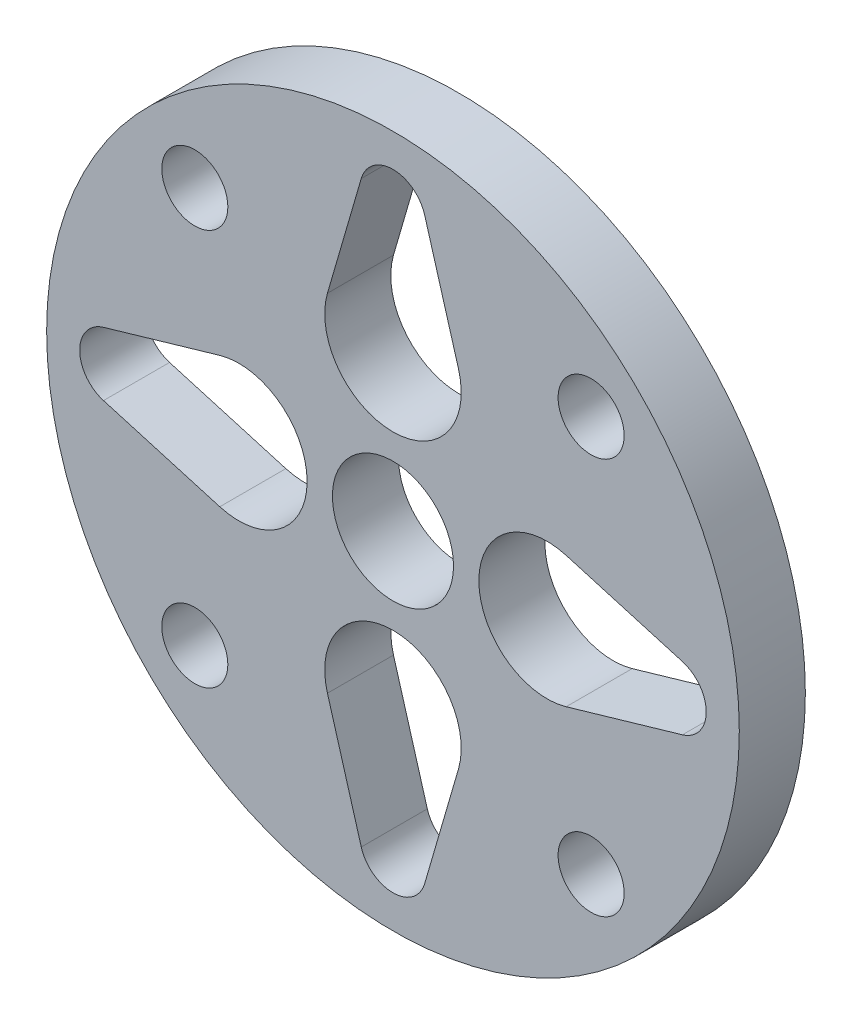
ISO-10303-21;
HEADER;
FILE_DESCRIPTION(('STEP AP214'),'2;1');
FILE_NAME('part.step','',(''),(''),'','','');
FILE_SCHEMA(('AUTOMOTIVE_DESIGN { 1 0 10303 214 1 1 1 1 }'));
ENDSEC;
DATA;
#1=APPLICATION_CONTEXT('core data for automotive mechanical design processes');
#2=APPLICATION_PROTOCOL_DEFINITION('international standard','automotive_design',2000,#1);
#3=PRODUCT_CONTEXT('',#1,'mechanical');
#4=PRODUCT('Part','Part','',(#3));
#5=PRODUCT_RELATED_PRODUCT_CATEGORY('part','',(#4));
#6=PRODUCT_DEFINITION_FORMATION('','',#4);
#7=PRODUCT_DEFINITION_CONTEXT('part definition',#1,'design');
#8=PRODUCT_DEFINITION('design','',#6,#7);
#9=PRODUCT_DEFINITION_SHAPE('','',#8);
#10=(LENGTH_UNIT() NAMED_UNIT(*) SI_UNIT(.MILLI.,.METRE.));
#11=(NAMED_UNIT(*) PLANE_ANGLE_UNIT() SI_UNIT($,.RADIAN.));
#12=(NAMED_UNIT(*) SI_UNIT($,.STERADIAN.) SOLID_ANGLE_UNIT());
#13=UNCERTAINTY_MEASURE_WITH_UNIT(LENGTH_MEASURE(1.E-05),#10,'distance_accuracy_value','');
#14=(GEOMETRIC_REPRESENTATION_CONTEXT(3) GLOBAL_UNCERTAINTY_ASSIGNED_CONTEXT((#13)) GLOBAL_UNIT_ASSIGNED_CONTEXT((#10,
#11,#12)) REPRESENTATION_CONTEXT('',''));
#15=CARTESIAN_POINT('',(0.,0.,0.));
#16=DIRECTION('',(0.,0.,1.));
#17=DIRECTION('',(1.,0.,0.));
#18=AXIS2_PLACEMENT_3D('',#15,#16,#17);
#19=CARTESIAN_POINT('',(22.4681726177,284.7304475597,3.));
#20=DIRECTION('',(0.,0.,1.));
#21=DIRECTION('',(1.,0.,0.));
#22=AXIS2_PLACEMENT_3D('',#19,#20,#21);
#23=PLANE('',#22);
#24=CARTESIAN_POINT('',(13.4681726177,293.7304475597,3.));
#25=DIRECTION('',(0.,0.,1.));
#26=DIRECTION('',(1.,0.,0.));
#27=AXIS2_PLACEMENT_3D('',#24,#25,#26);
#28=CIRCLE('',#27,1.5);
#29=CARTESIAN_POINT('',(14.9681726177,293.7304475597,3.));
#30=VERTEX_POINT('',#29);
#31=EDGE_CURVE('E306',#30,#30,#28,.T.);
#32=ORIENTED_EDGE('',*,*,#31,.F.);
#33=EDGE_LOOP('',(#32));
#34=FACE_BOUND('',#33,.T.);
#35=CARTESIAN_POINT('',(31.4681726177,275.7304475597,3.));
#36=DIRECTION('',(0.,0.,1.));
#37=DIRECTION('',(1.,0.,0.));
#38=AXIS2_PLACEMENT_3D('',#35,#36,#37);
#39=CIRCLE('',#38,1.5);
#40=CARTESIAN_POINT('',(32.9681726177,275.7304475597,3.));
#41=VERTEX_POINT('',#40);
#42=EDGE_CURVE('E316',#41,#41,#39,.T.);
#43=ORIENTED_EDGE('',*,*,#42,.F.);
#44=EDGE_LOOP('',(#43));
#45=FACE_BOUND('',#44,.T.);
#46=DIRECTION('',(0.960194171098327,0.279333409725363,0.));
#47=VECTOR('',#46,1.);
#48=CARTESIAN_POINT('',(35.6150947936,283.2901563031,3.));
#49=LINE('',#48,#47);
#50=CARTESIAN_POINT('',(30.3341061878,281.7538456293,3.));
#51=VERTEX_POINT('',#50);
#52=CARTESIAN_POINT('',(35.6150947936,283.2901563031,3.));
#53=VERTEX_POINT('',#52);
#54=EDGE_CURVE('E154',#51,#53,#49,.T.);
#55=ORIENTED_EDGE('',*,*,#54,.F.);
#56=CARTESIAN_POINT('',(29.468172617635,284.7304475597,3.));
#57=DIRECTION('',(0.,0.,1.));
#58=DIRECTION('',(1.,0.,0.));
#59=AXIS2_PLACEMENT_3D('',#56,#57,#58);
#60=CIRCLE('',#59,3.09999999999996);
#61=CARTESIAN_POINT('',(30.3341061878,287.7070494901,3.));
#62=VERTEX_POINT('',#61);
#63=EDGE_CURVE('E146',#62,#51,#60,.T.);
#64=ORIENTED_EDGE('',*,*,#63,.F.);
#65=DIRECTION('',(-0.960194171103202,0.279333409708604,0.));
#66=VECTOR('',#65,1.);
#67=CARTESIAN_POINT('',(35.6150947936,286.1707388164,3.));
#68=LINE('',#67,#66);
#69=CARTESIAN_POINT('',(35.6150947936,286.1707388164,3.));
#70=VERTEX_POINT('',#69);
#71=EDGE_CURVE('E169',#70,#62,#68,.T.);
#72=ORIENTED_EDGE('',*,*,#71,.F.);
#73=CARTESIAN_POINT('',(35.1960946790205,284.73044755975,3.));
#74=DIRECTION('',(0.,0.,1.));
#75=DIRECTION('',(1.,0.,0.));
#76=AXIS2_PLACEMENT_3D('',#73,#74,#75);
#77=CIRCLE('',#76,1.50000000000003);
#78=EDGE_CURVE('E167',#53,#70,#77,.T.);
#79=ORIENTED_EDGE('',*,*,#78,.F.);
#80=EDGE_LOOP('',(#55,#64,#72,#79));
#81=FACE_BOUND('',#80,.T.);
#82=DIRECTION('',(-0.960194171104621,-0.279333409703727,0.));
#83=VECTOR('',#82,1.);
#84=CARTESIAN_POINT('',(9.3212504417,286.1707388164,3.));
#85=LINE('',#84,#83);
#86=CARTESIAN_POINT('',(14.6022390476,287.7070494901,3.));
#87=VERTEX_POINT('',#86);
#88=CARTESIAN_POINT('',(9.32125044170001,286.1707388164,3.));
#89=VERTEX_POINT('',#88);
#90=EDGE_CURVE('E218',#87,#89,#85,.T.);
#91=ORIENTED_EDGE('',*,*,#90,.F.);
#92=CARTESIAN_POINT('',(15.468172617765,284.7304475597,3.));
#93=DIRECTION('',(0.,0.,1.));
#94=DIRECTION('',(1.,0.,0.));
#95=AXIS2_PLACEMENT_3D('',#92,#93,#94);
#96=CIRCLE('',#95,3.09999999999996);
#97=CARTESIAN_POINT('',(14.6022390476,281.7538456293,3.));
#98=VERTEX_POINT('',#97);
#99=EDGE_CURVE('E216',#98,#87,#96,.T.);
#100=ORIENTED_EDGE('',*,*,#99,.F.);
#101=DIRECTION('',(0.960194171099745,-0.279333409720486,0.));
#102=VECTOR('',#101,1.);
#103=CARTESIAN_POINT('',(9.3212504417,283.2901563031,3.));
#104=LINE('',#103,#102);
#105=CARTESIAN_POINT('',(9.3212504417,283.2901563031,3.));
#106=VERTEX_POINT('',#105);
#107=EDGE_CURVE('E224',#106,#98,#104,.T.);
#108=ORIENTED_EDGE('',*,*,#107,.F.);
#109=CARTESIAN_POINT('',(9.74025055627935,284.73044755975,3.));
#110=DIRECTION('',(0.,0.,1.));
#111=DIRECTION('',(1.,0.,0.));
#112=AXIS2_PLACEMENT_3D('',#109,#110,#111);
#113=CIRCLE('',#112,1.49999999999997);
#114=EDGE_CURVE('E221',#89,#106,#113,.T.);
#115=ORIENTED_EDGE('',*,*,#114,.F.);
#116=EDGE_LOOP('',(#91,#100,#108,#115));
#117=FACE_BOUND('',#116,.T.);
#118=CARTESIAN_POINT('',(22.4681726177,284.7304475597,3.));
#119=DIRECTION('',(0.,0.,1.));
#120=DIRECTION('',(1.,0.,0.));
#121=AXIS2_PLACEMENT_3D('',#118,#119,#120);
#122=CIRCLE('',#121,15.73);
#123=CARTESIAN_POINT('',(38.1981726177,284.7304475597,3.));
#124=VERTEX_POINT('',#123);
#125=EDGE_CURVE('E11',#124,#124,#122,.T.);
#126=ORIENTED_EDGE('',*,*,#125,.T.);
#127=EDGE_LOOP('',(#126));
#128=FACE_BOUND('',#127,.T.);
#129=DIRECTION('',(-0.279333409725365,0.960194171098326,0.));
#130=VECTOR('',#129,1.);
#131=CARTESIAN_POINT('',(23.9084638743,297.8773697356,3.));
#132=LINE('',#131,#130);
#133=CARTESIAN_POINT('',(25.4447745481,292.5963811298,3.));
#134=VERTEX_POINT('',#133);
#135=CARTESIAN_POINT('',(23.9084638743,297.8773697356,3.));
#136=VERTEX_POINT('',#135);
#137=EDGE_CURVE('E249',#134,#136,#132,.T.);
#138=ORIENTED_EDGE('',*,*,#137,.F.);
#139=CARTESIAN_POINT('',(22.4681726177,291.730447559635,3.));
#140=DIRECTION('',(0.,0.,1.));
#141=DIRECTION('',(1.,0.,0.));
#142=AXIS2_PLACEMENT_3D('',#139,#140,#141);
#143=CIRCLE('',#142,3.1);
#144=CARTESIAN_POINT('',(19.4915706873,292.5963811298,3.));
#145=VERTEX_POINT('',#144);
#146=EDGE_CURVE('E247',#145,#134,#143,.T.);
#147=ORIENTED_EDGE('',*,*,#146,.F.);
#148=DIRECTION('',(-0.279333409708601,-0.960194171103203,0.));
#149=VECTOR('',#148,1.);
#150=CARTESIAN_POINT('',(21.027881361,297.8773697356,3.));
#151=LINE('',#150,#149);
#152=CARTESIAN_POINT('',(21.027881361,297.8773697356,3.));
#153=VERTEX_POINT('',#152);
#154=EDGE_CURVE('E255',#153,#145,#151,.T.);
#155=ORIENTED_EDGE('',*,*,#154,.F.);
#156=CARTESIAN_POINT('',(22.46817261765,297.45836962102,3.));
#157=DIRECTION('',(0.,0.,1.));
#158=DIRECTION('',(1.,0.,0.));
#159=AXIS2_PLACEMENT_3D('',#156,#157,#158);
#160=CIRCLE('',#159,1.50000000000001);
#161=EDGE_CURVE('E252',#136,#153,#160,.T.);
#162=ORIENTED_EDGE('',*,*,#161,.F.);
#163=EDGE_LOOP('',(#138,#147,#155,#162));
#164=FACE_BOUND('',#163,.T.);
#165=DIRECTION('',(0.279333409708598,-0.960194171103203,0.));
#166=VECTOR('',#165,1.);
#167=CARTESIAN_POINT('',(21.027881361,271.5835253838,3.));
#168=LINE('',#167,#166);
#169=CARTESIAN_POINT('',(19.4915706873,276.8645139896,3.));
#170=VERTEX_POINT('',#169);
#171=CARTESIAN_POINT('',(21.027881361,271.5835253838,3.));
#172=VERTEX_POINT('',#171);
#173=EDGE_CURVE('E187',#170,#172,#168,.T.);
#174=ORIENTED_EDGE('',*,*,#173,.F.);
#175=CARTESIAN_POINT('',(22.4681726177,277.730447559765,3.));
#176=DIRECTION('',(0.,0.,1.));
#177=DIRECTION('',(1.,0.,0.));
#178=AXIS2_PLACEMENT_3D('',#175,#176,#177);
#179=CIRCLE('',#178,3.1);
#180=CARTESIAN_POINT('',(25.4447745481,276.8645139896,3.));
#181=VERTEX_POINT('',#180);
#182=EDGE_CURVE('E185',#181,#170,#179,.T.);
#183=ORIENTED_EDGE('',*,*,#182,.F.);
#184=DIRECTION('',(0.279333409725362,0.960194171098327,0.));
#185=VECTOR('',#184,1.);
#186=CARTESIAN_POINT('',(23.9084638743,271.5835253838,3.));
#187=LINE('',#186,#185);
#188=CARTESIAN_POINT('',(23.9084638743,271.5835253838,3.));
#189=VERTEX_POINT('',#188);
#190=EDGE_CURVE('E193',#189,#181,#187,.T.);
#191=ORIENTED_EDGE('',*,*,#190,.F.);
#192=CARTESIAN_POINT('',(22.46817261765,272.002525498379,3.));
#193=DIRECTION('',(0.,0.,1.));
#194=DIRECTION('',(1.,0.,0.));
#195=AXIS2_PLACEMENT_3D('',#192,#193,#194);
#196=CIRCLE('',#195,1.50000000000001);
#197=EDGE_CURVE('E190',#172,#189,#196,.T.);
#198=ORIENTED_EDGE('',*,*,#197,.F.);
#199=EDGE_LOOP('',(#174,#183,#191,#198));
#200=FACE_BOUND('',#199,.T.);
#201=CARTESIAN_POINT('',(13.4681726177,275.7304475597,3.));
#202=DIRECTION('',(0.,0.,1.));
#203=DIRECTION('',(1.,0.,0.));
#204=AXIS2_PLACEMENT_3D('',#201,#202,#203);
#205=CIRCLE('',#204,1.5);
#206=CARTESIAN_POINT('',(14.9681726177,275.7304475597,3.));
#207=VERTEX_POINT('',#206);
#208=EDGE_CURVE('E175',#207,#207,#205,.T.);
#209=ORIENTED_EDGE('',*,*,#208,.F.);
#210=EDGE_LOOP('',(#209));
#211=FACE_BOUND('',#210,.T.);
#212=CARTESIAN_POINT('',(31.4681726177,293.7304475597,3.));
#213=DIRECTION('',(0.,0.,1.));
#214=DIRECTION('',(1.,0.,0.));
#215=AXIS2_PLACEMENT_3D('',#212,#213,#214);
#216=CIRCLE('',#215,1.5);
#217=CARTESIAN_POINT('',(32.9681726177,293.7304475597,3.));
#218=VERTEX_POINT('',#217);
#219=EDGE_CURVE('E311',#218,#218,#216,.T.);
#220=ORIENTED_EDGE('',*,*,#219,.F.);
#221=EDGE_LOOP('',(#220));
#222=FACE_BOUND('',#221,.T.);
#223=CARTESIAN_POINT('',(22.4681726177,284.7304475597,3.));
#224=DIRECTION('',(0.,0.,1.));
#225=DIRECTION('',(1.,0.,0.));
#226=AXIS2_PLACEMENT_3D('',#223,#224,#225);
#227=CIRCLE('',#226,2.75);
#228=CARTESIAN_POINT('',(25.2181726177,284.7304475597,3.));
#229=VERTEX_POINT('',#228);
#230=EDGE_CURVE('E300',#229,#229,#227,.T.);
#231=ORIENTED_EDGE('',*,*,#230,.F.);
#232=EDGE_LOOP('',(#231));
#233=FACE_BOUND('',#232,.T.);
#234=ADVANCED_FACE('F33',(#34,#45,#81,#117,#128,#164,#200,#211,#222,#233),#23,.T.);
#235=CARTESIAN_POINT('',(22.4681726177,284.7304475597,0.));
#236=DIRECTION('',(0.,0.,1.));
#237=DIRECTION('',(1.,0.,0.));
#238=AXIS2_PLACEMENT_3D('',#235,#236,#237);
#239=PLANE('',#238);
#240=CARTESIAN_POINT('',(13.4681726177,293.7304475597,0.));
#241=DIRECTION('',(0.,0.,1.));
#242=DIRECTION('',(1.,0.,0.));
#243=AXIS2_PLACEMENT_3D('',#240,#241,#242);
#244=CIRCLE('',#243,1.5);
#245=CARTESIAN_POINT('',(14.9681726177,293.7304475597,0.));
#246=VERTEX_POINT('',#245);
#247=EDGE_CURVE('E303',#246,#246,#244,.T.);
#248=ORIENTED_EDGE('',*,*,#247,.T.);
#249=EDGE_LOOP('',(#248));
#250=FACE_BOUND('',#249,.T.);
#251=CARTESIAN_POINT('',(31.4681726177,275.7304475597,0.));
#252=DIRECTION('',(0.,0.,1.));
#253=DIRECTION('',(1.,0.,0.));
#254=AXIS2_PLACEMENT_3D('',#251,#252,#253);
#255=CIRCLE('',#254,1.5);
#256=CARTESIAN_POINT('',(32.9681726177,275.7304475597,0.));
#257=VERTEX_POINT('',#256);
#258=EDGE_CURVE('E314',#257,#257,#255,.T.);
#259=ORIENTED_EDGE('',*,*,#258,.T.);
#260=EDGE_LOOP('',(#259));
#261=FACE_BOUND('',#260,.T.);
#262=CARTESIAN_POINT('',(29.468172617635,284.7304475597,0.));
#263=DIRECTION('',(0.,0.,1.));
#264=DIRECTION('',(1.,0.,0.));
#265=AXIS2_PLACEMENT_3D('',#262,#263,#264);
#266=CIRCLE('',#265,3.09999999999996);
#267=CARTESIAN_POINT('',(30.3341061878,287.7070494901,0.));
#268=VERTEX_POINT('',#267);
#269=CARTESIAN_POINT('',(30.3341061878,281.7538456293,0.));
#270=VERTEX_POINT('',#269);
#271=EDGE_CURVE('E56',#268,#270,#266,.T.);
#272=ORIENTED_EDGE('',*,*,#271,.T.);
#273=DIRECTION('',(0.960194171098327,0.279333409725363,0.));
#274=VECTOR('',#273,1.);
#275=CARTESIAN_POINT('',(35.6150947936,283.2901563031,0.));
#276=LINE('',#275,#274);
#277=CARTESIAN_POINT('',(35.6150947936,283.2901563031,0.));
#278=VERTEX_POINT('',#277);
#279=EDGE_CURVE('E161',#270,#278,#276,.T.);
#280=ORIENTED_EDGE('',*,*,#279,.T.);
#281=CARTESIAN_POINT('',(35.1960946790205,284.73044755975,0.));
#282=DIRECTION('',(0.,0.,1.));
#283=DIRECTION('',(1.,0.,0.));
#284=AXIS2_PLACEMENT_3D('',#281,#282,#283);
#285=CIRCLE('',#284,1.50000000000003);
#286=CARTESIAN_POINT('',(35.6150947936,286.1707388164,0.));
#287=VERTEX_POINT('',#286);
#288=EDGE_CURVE('E177',#278,#287,#285,.T.);
#289=ORIENTED_EDGE('',*,*,#288,.T.);
#290=DIRECTION('',(-0.960194171103202,0.279333409708604,0.));
#291=VECTOR('',#290,1.);
#292=CARTESIAN_POINT('',(35.6150947936,286.1707388164,0.));
#293=LINE('',#292,#291);
#294=EDGE_CURVE('E155',#287,#268,#293,.T.);
#295=ORIENTED_EDGE('',*,*,#294,.T.);
#296=EDGE_LOOP('',(#272,#280,#289,#295));
#297=FACE_BOUND('',#296,.T.);
#298=CARTESIAN_POINT('',(15.468172617765,284.7304475597,0.));
#299=DIRECTION('',(0.,0.,1.));
#300=DIRECTION('',(1.,0.,0.));
#301=AXIS2_PLACEMENT_3D('',#298,#299,#300);
#302=CIRCLE('',#301,3.09999999999996);
#303=CARTESIAN_POINT('',(14.6022390476,281.7538456293,0.));
#304=VERTEX_POINT('',#303);
#305=CARTESIAN_POINT('',(14.6022390476,287.7070494901,0.));
#306=VERTEX_POINT('',#305);
#307=EDGE_CURVE('E215',#304,#306,#302,.T.);
#308=ORIENTED_EDGE('',*,*,#307,.T.);
#309=DIRECTION('',(-0.960194171104621,-0.279333409703727,0.));
#310=VECTOR('',#309,1.);
#311=CARTESIAN_POINT('',(9.3212504417,286.1707388164,0.));
#312=LINE('',#311,#310);
#313=CARTESIAN_POINT('',(9.32125044170001,286.1707388164,0.));
#314=VERTEX_POINT('',#313);
#315=EDGE_CURVE('E229',#306,#314,#312,.T.);
#316=ORIENTED_EDGE('',*,*,#315,.T.);
#317=CARTESIAN_POINT('',(9.74025055627935,284.73044755975,0.));
#318=DIRECTION('',(0.,0.,1.));
#319=DIRECTION('',(1.,0.,0.));
#320=AXIS2_PLACEMENT_3D('',#317,#318,#319);
#321=CIRCLE('',#320,1.49999999999997);
#322=CARTESIAN_POINT('',(9.3212504417,283.2901563031,0.));
#323=VERTEX_POINT('',#322);
#324=EDGE_CURVE('E232',#314,#323,#321,.T.);
#325=ORIENTED_EDGE('',*,*,#324,.T.);
#326=DIRECTION('',(0.960194171099745,-0.279333409720486,0.));
#327=VECTOR('',#326,1.);
#328=CARTESIAN_POINT('',(9.3212504417,283.2901563031,0.));
#329=LINE('',#328,#327);
#330=EDGE_CURVE('E219',#323,#304,#329,.T.);
#331=ORIENTED_EDGE('',*,*,#330,.T.);
#332=EDGE_LOOP('',(#308,#316,#325,#331));
#333=FACE_BOUND('',#332,.T.);
#334=CARTESIAN_POINT('',(22.4681726177,284.7304475597,0.));
#335=DIRECTION('',(0.,0.,1.));
#336=DIRECTION('',(1.,0.,0.));
#337=AXIS2_PLACEMENT_3D('',#334,#335,#336);
#338=CIRCLE('',#337,15.73);
#339=CARTESIAN_POINT('',(38.1981726177,284.7304475597,0.));
#340=VERTEX_POINT('',#339);
#341=EDGE_CURVE('E37',#340,#340,#338,.T.);
#342=ORIENTED_EDGE('',*,*,#341,.F.);
#343=EDGE_LOOP('',(#342));
#344=FACE_BOUND('',#343,.T.);
#345=CARTESIAN_POINT('',(22.4681726177,291.730447559635,0.));
#346=DIRECTION('',(0.,0.,1.));
#347=DIRECTION('',(1.,0.,0.));
#348=AXIS2_PLACEMENT_3D('',#345,#346,#347);
#349=CIRCLE('',#348,3.1);
#350=CARTESIAN_POINT('',(19.4915706873,292.5963811298,0.));
#351=VERTEX_POINT('',#350);
#352=CARTESIAN_POINT('',(25.4447745481,292.5963811298,0.));
#353=VERTEX_POINT('',#352);
#354=EDGE_CURVE('E246',#351,#353,#349,.T.);
#355=ORIENTED_EDGE('',*,*,#354,.T.);
#356=DIRECTION('',(-0.279333409725365,0.960194171098326,0.));
#357=VECTOR('',#356,1.);
#358=CARTESIAN_POINT('',(23.9084638743,297.8773697356,0.));
#359=LINE('',#358,#357);
#360=CARTESIAN_POINT('',(23.9084638743,297.8773697356,0.));
#361=VERTEX_POINT('',#360);
#362=EDGE_CURVE('E260',#353,#361,#359,.T.);
#363=ORIENTED_EDGE('',*,*,#362,.T.);
#364=CARTESIAN_POINT('',(22.46817261765,297.45836962102,0.));
#365=DIRECTION('',(0.,0.,1.));
#366=DIRECTION('',(1.,0.,0.));
#367=AXIS2_PLACEMENT_3D('',#364,#365,#366);
#368=CIRCLE('',#367,1.50000000000001);
#369=CARTESIAN_POINT('',(21.027881361,297.8773697356,0.));
#370=VERTEX_POINT('',#369);
#371=EDGE_CURVE('E263',#361,#370,#368,.T.);
#372=ORIENTED_EDGE('',*,*,#371,.T.);
#373=DIRECTION('',(-0.279333409708601,-0.960194171103203,0.));
#374=VECTOR('',#373,1.);
#375=CARTESIAN_POINT('',(21.027881361,297.8773697356,0.));
#376=LINE('',#375,#374);
#377=EDGE_CURVE('E250',#370,#351,#376,.T.);
#378=ORIENTED_EDGE('',*,*,#377,.T.);
#379=EDGE_LOOP('',(#355,#363,#372,#378));
#380=FACE_BOUND('',#379,.T.);
#381=CARTESIAN_POINT('',(22.4681726177,277.730447559765,0.));
#382=DIRECTION('',(0.,0.,1.));
#383=DIRECTION('',(1.,0.,0.));
#384=AXIS2_PLACEMENT_3D('',#381,#382,#383);
#385=CIRCLE('',#384,3.1);
#386=CARTESIAN_POINT('',(25.4447745481,276.8645139896,0.));
#387=VERTEX_POINT('',#386);
#388=CARTESIAN_POINT('',(19.4915706873,276.8645139896,0.));
#389=VERTEX_POINT('',#388);
#390=EDGE_CURVE('E162',#387,#389,#385,.T.);
#391=ORIENTED_EDGE('',*,*,#390,.T.);
#392=DIRECTION('',(0.279333409708598,-0.960194171103203,0.));
#393=VECTOR('',#392,1.);
#394=CARTESIAN_POINT('',(21.027881361,271.5835253838,0.));
#395=LINE('',#394,#393);
#396=CARTESIAN_POINT('',(21.027881361,271.5835253838,0.));
#397=VERTEX_POINT('',#396);
#398=EDGE_CURVE('E198',#389,#397,#395,.T.);
#399=ORIENTED_EDGE('',*,*,#398,.T.);
#400=CARTESIAN_POINT('',(22.46817261765,272.002525498379,0.));
#401=DIRECTION('',(0.,0.,1.));
#402=DIRECTION('',(1.,0.,0.));
#403=AXIS2_PLACEMENT_3D('',#400,#401,#402);
#404=CIRCLE('',#403,1.50000000000001);
#405=CARTESIAN_POINT('',(23.9084638743,271.5835253838,0.));
#406=VERTEX_POINT('',#405);
#407=EDGE_CURVE('E201',#397,#406,#404,.T.);
#408=ORIENTED_EDGE('',*,*,#407,.T.);
#409=DIRECTION('',(0.279333409725362,0.960194171098327,0.));
#410=VECTOR('',#409,1.);
#411=CARTESIAN_POINT('',(23.9084638743,271.5835253838,0.));
#412=LINE('',#411,#410);
#413=EDGE_CURVE('E188',#406,#387,#412,.T.);
#414=ORIENTED_EDGE('',*,*,#413,.T.);
#415=EDGE_LOOP('',(#391,#399,#408,#414));
#416=FACE_BOUND('',#415,.T.);
#417=CARTESIAN_POINT('',(13.4681726177,275.7304475597,0.));
#418=DIRECTION('',(0.,0.,1.));
#419=DIRECTION('',(1.,0.,0.));
#420=AXIS2_PLACEMENT_3D('',#417,#418,#419);
#421=CIRCLE('',#420,1.5);
#422=CARTESIAN_POINT('',(14.9681726177,275.7304475597,0.));
#423=VERTEX_POINT('',#422);
#424=EDGE_CURVE('E291',#423,#423,#421,.T.);
#425=ORIENTED_EDGE('',*,*,#424,.T.);
#426=EDGE_LOOP('',(#425));
#427=FACE_BOUND('',#426,.T.);
#428=CARTESIAN_POINT('',(31.4681726177,293.7304475597,0.));
#429=DIRECTION('',(0.,0.,1.));
#430=DIRECTION('',(1.,0.,0.));
#431=AXIS2_PLACEMENT_3D('',#428,#429,#430);
#432=CIRCLE('',#431,1.5);
#433=CARTESIAN_POINT('',(32.9681726177,293.7304475597,0.));
#434=VERTEX_POINT('',#433);
#435=EDGE_CURVE('E295',#434,#434,#432,.T.);
#436=ORIENTED_EDGE('',*,*,#435,.T.);
#437=EDGE_LOOP('',(#436));
#438=FACE_BOUND('',#437,.T.);
#439=CARTESIAN_POINT('',(22.4681726177,284.7304475597,0.));
#440=DIRECTION('',(0.,0.,1.));
#441=DIRECTION('',(1.,0.,0.));
#442=AXIS2_PLACEMENT_3D('',#439,#440,#441);
#443=CIRCLE('',#442,2.75);
#444=CARTESIAN_POINT('',(25.2181726177,284.7304475597,0.));
#445=VERTEX_POINT('',#444);
#446=EDGE_CURVE('E298',#445,#445,#443,.T.);
#447=ORIENTED_EDGE('',*,*,#446,.T.);
#448=EDGE_LOOP('',(#447));
#449=FACE_BOUND('',#448,.T.);
#450=ADVANCED_FACE('F282',(#250,#261,#297,#333,#344,#380,#416,#427,#438,#449),#239,.F.);
#451=CARTESIAN_POINT('',(22.4681726177,284.7304475597,3.));
#452=DIRECTION('',(0.,0.,-1.));
#453=DIRECTION('',(-1.,0.,0.));
#454=AXIS2_PLACEMENT_3D('',#451,#452,#453);
#455=CYLINDRICAL_SURFACE('',#454,15.73);
#456=ORIENTED_EDGE('',*,*,#125,.F.);
#457=EDGE_LOOP('',(#456));
#458=FACE_BOUND('',#457,.T.);
#459=ORIENTED_EDGE('',*,*,#341,.T.);
#460=EDGE_LOOP('',(#459));
#461=FACE_BOUND('',#460,.T.);
#462=ADVANCED_FACE('F35',(#458,#461),#455,.T.);
#463=CARTESIAN_POINT('',(22.4681726177,291.730447559635,3.));
#464=DIRECTION('',(0.,0.,-1.));
#465=DIRECTION('',(-1.,0.,0.));
#466=AXIS2_PLACEMENT_3D('',#463,#464,#465);
#467=CYLINDRICAL_SURFACE('',#466,3.1);
#468=ORIENTED_EDGE('',*,*,#354,.F.);
#469=DIRECTION('',(0.,0.,-1.));
#470=VECTOR('',#469,1.);
#471=CARTESIAN_POINT('',(19.4915706873,292.5963811298,3.));
#472=LINE('',#471,#470);
#473=EDGE_CURVE('E257',#145,#351,#472,.T.);
#474=ORIENTED_EDGE('',*,*,#473,.F.);
#475=ORIENTED_EDGE('',*,*,#146,.T.);
#476=DIRECTION('',(0.,0.,-1.));
#477=VECTOR('',#476,1.);
#478=CARTESIAN_POINT('',(25.4447745481,292.5963811298,3.));
#479=LINE('',#478,#477);
#480=EDGE_CURVE('E274',#134,#353,#479,.T.);
#481=ORIENTED_EDGE('',*,*,#480,.T.);
#482=EDGE_LOOP('',(#468,#474,#475,#481));
#483=FACE_BOUND('',#482,.T.);
#484=ADVANCED_FACE('F409',(#483),#467,.F.);
#485=CARTESIAN_POINT('',(23.9084638743,297.8773697356,3.));
#486=DIRECTION('',(-0.960194171098326,-0.279333409725364,0.));
#487=DIRECTION('',(0.279333409725365,-0.960194171098326,0.));
#488=AXIS2_PLACEMENT_3D('',#485,#486,#487);
#489=PLANE('',#488);
#490=ORIENTED_EDGE('',*,*,#362,.F.);
#491=ORIENTED_EDGE('',*,*,#480,.F.);
#492=ORIENTED_EDGE('',*,*,#137,.T.);
#493=DIRECTION('',(0.,0.,-1.));
#494=VECTOR('',#493,1.);
#495=CARTESIAN_POINT('',(23.9084638743,297.8773697356,3.));
#496=LINE('',#495,#494);
#497=EDGE_CURVE('E272',#136,#361,#496,.T.);
#498=ORIENTED_EDGE('',*,*,#497,.T.);
#499=EDGE_LOOP('',(#490,#491,#492,#498));
#500=FACE_BOUND('',#499,.T.);
#501=ADVANCED_FACE('F405',(#500),#489,.T.);
#502=CARTESIAN_POINT('',(22.46817261765,297.45836962102,3.));
#503=DIRECTION('',(0.,0.,-1.));
#504=DIRECTION('',(-1.,0.,0.));
#505=AXIS2_PLACEMENT_3D('',#502,#503,#504);
#506=CYLINDRICAL_SURFACE('',#505,1.50000000000001);
#507=ORIENTED_EDGE('',*,*,#371,.F.);
#508=ORIENTED_EDGE('',*,*,#497,.F.);
#509=ORIENTED_EDGE('',*,*,#161,.T.);
#510=DIRECTION('',(0.,0.,-1.));
#511=VECTOR('',#510,1.);
#512=CARTESIAN_POINT('',(21.027881361,297.8773697356,3.));
#513=LINE('',#512,#511);
#514=EDGE_CURVE('E270',#153,#370,#513,.T.);
#515=ORIENTED_EDGE('',*,*,#514,.T.);
#516=EDGE_LOOP('',(#507,#508,#509,#515));
#517=FACE_BOUND('',#516,.T.);
#518=ADVANCED_FACE('F401',(#517),#506,.F.);
#519=CARTESIAN_POINT('',(21.027881361,297.8773697356,3.));
#520=DIRECTION('',(0.960194171103203,-0.279333409708601,0.));
#521=DIRECTION('',(0.279333409708601,0.960194171103203,0.));
#522=AXIS2_PLACEMENT_3D('',#519,#520,#521);
#523=PLANE('',#522);
#524=ORIENTED_EDGE('',*,*,#377,.F.);
#525=ORIENTED_EDGE('',*,*,#514,.F.);
#526=ORIENTED_EDGE('',*,*,#154,.T.);
#527=ORIENTED_EDGE('',*,*,#473,.T.);
#528=EDGE_LOOP('',(#524,#525,#526,#527));
#529=FACE_BOUND('',#528,.T.);
#530=ADVANCED_FACE('F397',(#529),#523,.T.);
#531=CARTESIAN_POINT('',(15.468172617765,284.7304475597,3.));
#532=DIRECTION('',(0.,0.,-1.));
#533=DIRECTION('',(-1.,0.,0.));
#534=AXIS2_PLACEMENT_3D('',#531,#532,#533);
#535=CYLINDRICAL_SURFACE('',#534,3.09999999999996);
#536=ORIENTED_EDGE('',*,*,#307,.F.);
#537=DIRECTION('',(0.,0.,-1.));
#538=VECTOR('',#537,1.);
#539=CARTESIAN_POINT('',(14.6022390476,281.7538456293,3.));
#540=LINE('',#539,#538);
#541=EDGE_CURVE('E226',#98,#304,#540,.T.);
#542=ORIENTED_EDGE('',*,*,#541,.F.);
#543=ORIENTED_EDGE('',*,*,#99,.T.);
#544=DIRECTION('',(0.,0.,-1.));
#545=VECTOR('',#544,1.);
#546=CARTESIAN_POINT('',(14.6022390476,287.7070494901,3.));
#547=LINE('',#546,#545);
#548=EDGE_CURVE('E243',#87,#306,#547,.T.);
#549=ORIENTED_EDGE('',*,*,#548,.T.);
#550=EDGE_LOOP('',(#536,#542,#543,#549));
#551=FACE_BOUND('',#550,.T.);
#552=ADVANCED_FACE('F393',(#551),#535,.F.);
#553=CARTESIAN_POINT('',(9.3212504417,286.1707388164,3.));
#554=DIRECTION('',(0.279333409703727,-0.960194171104621,0.));
#555=DIRECTION('',(0.960194171104621,0.279333409703727,0.));
#556=AXIS2_PLACEMENT_3D('',#553,#554,#555);
#557=PLANE('',#556);
#558=ORIENTED_EDGE('',*,*,#315,.F.);
#559=ORIENTED_EDGE('',*,*,#548,.F.);
#560=ORIENTED_EDGE('',*,*,#90,.T.);
#561=DIRECTION('',(0.,0.,-1.));
#562=VECTOR('',#561,1.);
#563=CARTESIAN_POINT('',(9.32125044170001,286.1707388164,3.));
#564=LINE('',#563,#562);
#565=EDGE_CURVE('E241',#89,#314,#564,.T.);
#566=ORIENTED_EDGE('',*,*,#565,.T.);
#567=EDGE_LOOP('',(#558,#559,#560,#566));
#568=FACE_BOUND('',#567,.T.);
#569=ADVANCED_FACE('F389',(#568),#557,.T.);
#570=CARTESIAN_POINT('',(9.74025055627935,284.73044755975,3.));
#571=DIRECTION('',(0.,0.,-1.));
#572=DIRECTION('',(-1.,0.,0.));
#573=AXIS2_PLACEMENT_3D('',#570,#571,#572);
#574=CYLINDRICAL_SURFACE('',#573,1.49999999999997);
#575=ORIENTED_EDGE('',*,*,#324,.F.);
#576=ORIENTED_EDGE('',*,*,#565,.F.);
#577=ORIENTED_EDGE('',*,*,#114,.T.);
#578=DIRECTION('',(0.,0.,-1.));
#579=VECTOR('',#578,1.);
#580=CARTESIAN_POINT('',(9.3212504417,283.2901563031,3.));
#581=LINE('',#580,#579);
#582=EDGE_CURVE('E239',#106,#323,#581,.T.);
#583=ORIENTED_EDGE('',*,*,#582,.T.);
#584=EDGE_LOOP('',(#575,#576,#577,#583));
#585=FACE_BOUND('',#584,.T.);
#586=ADVANCED_FACE('F385',(#585),#574,.F.);
#587=CARTESIAN_POINT('',(9.3212504417,283.2901563031,3.));
#588=DIRECTION('',(0.279333409720486,0.960194171099745,0.));
#589=DIRECTION('',(-0.960194171099745,0.279333409720486,0.));
#590=AXIS2_PLACEMENT_3D('',#587,#588,#589);
#591=PLANE('',#590);
#592=ORIENTED_EDGE('',*,*,#330,.F.);
#593=ORIENTED_EDGE('',*,*,#582,.F.);
#594=ORIENTED_EDGE('',*,*,#107,.T.);
#595=ORIENTED_EDGE('',*,*,#541,.T.);
#596=EDGE_LOOP('',(#592,#593,#594,#595));
#597=FACE_BOUND('',#596,.T.);
#598=ADVANCED_FACE('F381',(#597),#591,.T.);
#599=CARTESIAN_POINT('',(22.4681726177,277.730447559765,3.));
#600=DIRECTION('',(0.,0.,-1.));
#601=DIRECTION('',(-1.,0.,0.));
#602=AXIS2_PLACEMENT_3D('',#599,#600,#601);
#603=CYLINDRICAL_SURFACE('',#602,3.1);
#604=ORIENTED_EDGE('',*,*,#390,.F.);
#605=DIRECTION('',(0.,0.,-1.));
#606=VECTOR('',#605,1.);
#607=CARTESIAN_POINT('',(25.4447745481,276.8645139896,3.));
#608=LINE('',#607,#606);
#609=EDGE_CURVE('E195',#181,#387,#608,.T.);
#610=ORIENTED_EDGE('',*,*,#609,.F.);
#611=ORIENTED_EDGE('',*,*,#182,.T.);
#612=DIRECTION('',(0.,0.,-1.));
#613=VECTOR('',#612,1.);
#614=CARTESIAN_POINT('',(19.4915706873,276.8645139896,3.));
#615=LINE('',#614,#613);
#616=EDGE_CURVE('E212',#170,#389,#615,.T.);
#617=ORIENTED_EDGE('',*,*,#616,.T.);
#618=EDGE_LOOP('',(#604,#610,#611,#617));
#619=FACE_BOUND('',#618,.T.);
#620=ADVANCED_FACE('F377',(#619),#603,.F.);
#621=CARTESIAN_POINT('',(21.027881361,271.5835253838,3.));
#622=DIRECTION('',(0.960194171103204,0.279333409708598,0.));
#623=DIRECTION('',(-0.279333409708598,0.960194171103204,0.));
#624=AXIS2_PLACEMENT_3D('',#621,#622,#623);
#625=PLANE('',#624);
#626=ORIENTED_EDGE('',*,*,#398,.F.);
#627=ORIENTED_EDGE('',*,*,#616,.F.);
#628=ORIENTED_EDGE('',*,*,#173,.T.);
#629=DIRECTION('',(0.,0.,-1.));
#630=VECTOR('',#629,1.);
#631=CARTESIAN_POINT('',(21.027881361,271.5835253838,3.));
#632=LINE('',#631,#630);
#633=EDGE_CURVE('E210',#172,#397,#632,.T.);
#634=ORIENTED_EDGE('',*,*,#633,.T.);
#635=EDGE_LOOP('',(#626,#627,#628,#634));
#636=FACE_BOUND('',#635,.T.);
#637=ADVANCED_FACE('F373',(#636),#625,.T.);
#638=CARTESIAN_POINT('',(22.46817261765,272.002525498379,3.));
#639=DIRECTION('',(0.,0.,-1.));
#640=DIRECTION('',(-1.,0.,0.));
#641=AXIS2_PLACEMENT_3D('',#638,#639,#640);
#642=CYLINDRICAL_SURFACE('',#641,1.50000000000001);
#643=ORIENTED_EDGE('',*,*,#407,.F.);
#644=ORIENTED_EDGE('',*,*,#633,.F.);
#645=ORIENTED_EDGE('',*,*,#197,.T.);
#646=DIRECTION('',(0.,0.,-1.));
#647=VECTOR('',#646,1.);
#648=CARTESIAN_POINT('',(23.9084638743,271.5835253838,3.));
#649=LINE('',#648,#647);
#650=EDGE_CURVE('E208',#189,#406,#649,.T.);
#651=ORIENTED_EDGE('',*,*,#650,.T.);
#652=EDGE_LOOP('',(#643,#644,#645,#651));
#653=FACE_BOUND('',#652,.T.);
#654=ADVANCED_FACE('F369',(#653),#642,.F.);
#655=CARTESIAN_POINT('',(23.9084638743,271.5835253838,3.));
#656=DIRECTION('',(-0.960194171098327,0.279333409725362,0.));
#657=DIRECTION('',(-0.279333409725362,-0.960194171098327,0.));
#658=AXIS2_PLACEMENT_3D('',#655,#656,#657);
#659=PLANE('',#658);
#660=ORIENTED_EDGE('',*,*,#413,.F.);
#661=ORIENTED_EDGE('',*,*,#650,.F.);
#662=ORIENTED_EDGE('',*,*,#190,.T.);
#663=ORIENTED_EDGE('',*,*,#609,.T.);
#664=EDGE_LOOP('',(#660,#661,#662,#663));
#665=FACE_BOUND('',#664,.T.);
#666=ADVANCED_FACE('F366',(#665),#659,.T.);
#667=CARTESIAN_POINT('',(29.468172617635,284.7304475597,3.));
#668=DIRECTION('',(0.,0.,-1.));
#669=DIRECTION('',(-1.,0.,0.));
#670=AXIS2_PLACEMENT_3D('',#667,#668,#669);
#671=CYLINDRICAL_SURFACE('',#670,3.09999999999996);
#672=ORIENTED_EDGE('',*,*,#271,.F.);
#673=DIRECTION('',(0.,0.,-1.));
#674=VECTOR('',#673,1.);
#675=CARTESIAN_POINT('',(30.3341061878,287.7070494901,3.));
#676=LINE('',#675,#674);
#677=EDGE_CURVE('E150',#62,#268,#676,.T.);
#678=ORIENTED_EDGE('',*,*,#677,.F.);
#679=ORIENTED_EDGE('',*,*,#63,.T.);
#680=DIRECTION('',(0.,0.,-1.));
#681=VECTOR('',#680,1.);
#682=CARTESIAN_POINT('',(30.3341061878,281.7538456293,3.));
#683=LINE('',#682,#681);
#684=EDGE_CURVE('E149',#51,#270,#683,.T.);
#685=ORIENTED_EDGE('',*,*,#684,.T.);
#686=EDGE_LOOP('',(#672,#678,#679,#685));
#687=FACE_BOUND('',#686,.T.);
#688=ADVANCED_FACE('F148',(#687),#671,.F.);
#689=CARTESIAN_POINT('',(35.6150947936,283.2901563031,3.));
#690=DIRECTION('',(-0.279333409725363,0.960194171098327,0.));
#691=DIRECTION('',(-0.960194171098327,-0.279333409725363,0.));
#692=AXIS2_PLACEMENT_3D('',#689,#690,#691);
#693=PLANE('',#692);
#694=ORIENTED_EDGE('',*,*,#279,.F.);
#695=ORIENTED_EDGE('',*,*,#684,.F.);
#696=ORIENTED_EDGE('',*,*,#54,.T.);
#697=DIRECTION('',(0.,0.,-1.));
#698=VECTOR('',#697,1.);
#699=CARTESIAN_POINT('',(35.6150947936,283.2901563031,3.));
#700=LINE('',#699,#698);
#701=EDGE_CURVE('E163',#53,#278,#700,.T.);
#702=ORIENTED_EDGE('',*,*,#701,.T.);
#703=EDGE_LOOP('',(#694,#695,#696,#702));
#704=FACE_BOUND('',#703,.T.);
#705=ADVANCED_FACE('F158',(#704),#693,.T.);
#706=CARTESIAN_POINT('',(35.1960946790205,284.73044755975,3.));
#707=DIRECTION('',(0.,0.,-1.));
#708=DIRECTION('',(-1.,0.,0.));
#709=AXIS2_PLACEMENT_3D('',#706,#707,#708);
#710=CYLINDRICAL_SURFACE('',#709,1.50000000000003);
#711=ORIENTED_EDGE('',*,*,#288,.F.);
#712=ORIENTED_EDGE('',*,*,#701,.F.);
#713=ORIENTED_EDGE('',*,*,#78,.T.);
#714=DIRECTION('',(0.,0.,-1.));
#715=VECTOR('',#714,1.);
#716=CARTESIAN_POINT('',(35.6150947936,286.1707388164,3.));
#717=LINE('',#716,#715);
#718=EDGE_CURVE('E48',#70,#287,#717,.T.);
#719=ORIENTED_EDGE('',*,*,#718,.T.);
#720=EDGE_LOOP('',(#711,#712,#713,#719));
#721=FACE_BOUND('',#720,.T.);
#722=ADVANCED_FACE('F358',(#721),#710,.F.);
#723=CARTESIAN_POINT('',(35.6150947936,286.1707388164,3.));
#724=DIRECTION('',(-0.279333409708604,-0.960194171103202,0.));
#725=DIRECTION('',(0.960194171103202,-0.279333409708604,0.));
#726=AXIS2_PLACEMENT_3D('',#723,#724,#725);
#727=PLANE('',#726);
#728=ORIENTED_EDGE('',*,*,#294,.F.);
#729=ORIENTED_EDGE('',*,*,#718,.F.);
#730=ORIENTED_EDGE('',*,*,#71,.T.);
#731=ORIENTED_EDGE('',*,*,#677,.T.);
#732=EDGE_LOOP('',(#728,#729,#730,#731));
#733=FACE_BOUND('',#732,.T.);
#734=ADVANCED_FACE('F355',(#733),#727,.T.);
#735=CARTESIAN_POINT('',(13.4681726177,275.7304475597,3.));
#736=DIRECTION('',(0.,0.,-1.));
#737=DIRECTION('',(-1.,0.,0.));
#738=AXIS2_PLACEMENT_3D('',#735,#736,#737);
#739=CYLINDRICAL_SURFACE('',#738,1.5);
#740=ORIENTED_EDGE('',*,*,#208,.T.);
#741=EDGE_LOOP('',(#740));
#742=FACE_BOUND('',#741,.T.);
#743=ORIENTED_EDGE('',*,*,#424,.F.);
#744=EDGE_LOOP('',(#743));
#745=FACE_BOUND('',#744,.T.);
#746=ADVANCED_FACE('F324',(#742,#745),#739,.F.);
#747=CARTESIAN_POINT('',(31.4681726177,275.7304475597,3.));
#748=DIRECTION('',(0.,0.,-1.));
#749=DIRECTION('',(-1.,0.,0.));
#750=AXIS2_PLACEMENT_3D('',#747,#748,#749);
#751=CYLINDRICAL_SURFACE('',#750,1.5);
#752=ORIENTED_EDGE('',*,*,#42,.T.);
#753=EDGE_LOOP('',(#752));
#754=FACE_BOUND('',#753,.T.);
#755=ORIENTED_EDGE('',*,*,#258,.F.);
#756=EDGE_LOOP('',(#755));
#757=FACE_BOUND('',#756,.T.);
#758=ADVANCED_FACE('F348',(#754,#757),#751,.F.);
#759=CARTESIAN_POINT('',(31.4681726177,293.7304475597,3.));
#760=DIRECTION('',(0.,0.,-1.));
#761=DIRECTION('',(-1.,0.,0.));
#762=AXIS2_PLACEMENT_3D('',#759,#760,#761);
#763=CYLINDRICAL_SURFACE('',#762,1.5);
#764=ORIENTED_EDGE('',*,*,#219,.T.);
#765=EDGE_LOOP('',(#764));
#766=FACE_BOUND('',#765,.T.);
#767=ORIENTED_EDGE('',*,*,#435,.F.);
#768=EDGE_LOOP('',(#767));
#769=FACE_BOUND('',#768,.T.);
#770=ADVANCED_FACE('F342',(#766,#769),#763,.F.);
#771=CARTESIAN_POINT('',(13.4681726177,293.7304475597,3.));
#772=DIRECTION('',(0.,0.,-1.));
#773=DIRECTION('',(-1.,0.,0.));
#774=AXIS2_PLACEMENT_3D('',#771,#772,#773);
#775=CYLINDRICAL_SURFACE('',#774,1.5);
#776=ORIENTED_EDGE('',*,*,#31,.T.);
#777=EDGE_LOOP('',(#776));
#778=FACE_BOUND('',#777,.T.);
#779=ORIENTED_EDGE('',*,*,#247,.F.);
#780=EDGE_LOOP('',(#779));
#781=FACE_BOUND('',#780,.T.);
#782=ADVANCED_FACE('F337',(#778,#781),#775,.F.);
#783=CARTESIAN_POINT('',(22.4681726177,284.7304475597,3.));
#784=DIRECTION('',(0.,0.,-1.));
#785=DIRECTION('',(-1.,0.,0.));
#786=AXIS2_PLACEMENT_3D('',#783,#784,#785);
#787=CYLINDRICAL_SURFACE('',#786,2.75);
#788=ORIENTED_EDGE('',*,*,#230,.T.);
#789=EDGE_LOOP('',(#788));
#790=FACE_BOUND('',#789,.T.);
#791=ORIENTED_EDGE('',*,*,#446,.F.);
#792=EDGE_LOOP('',(#791));
#793=FACE_BOUND('',#792,.T.);
#794=ADVANCED_FACE('F335',(#790,#793),#787,.F.);
#795=CLOSED_SHELL('',(#234,#450,#462,#484,#501,#518,#530,#552,#569,#586,#598,#620,#637,#654,
#666,#688,#705,#722,#734,#746,#758,#770,#782,#794));
#796=MANIFOLD_SOLID_BREP('B2',#795);
#797=ADVANCED_BREP_SHAPE_REPRESENTATION('',(#18,#796),#14);
#798=SHAPE_DEFINITION_REPRESENTATION(#9,#797);
ENDSEC;
END-ISO-10303-21;
